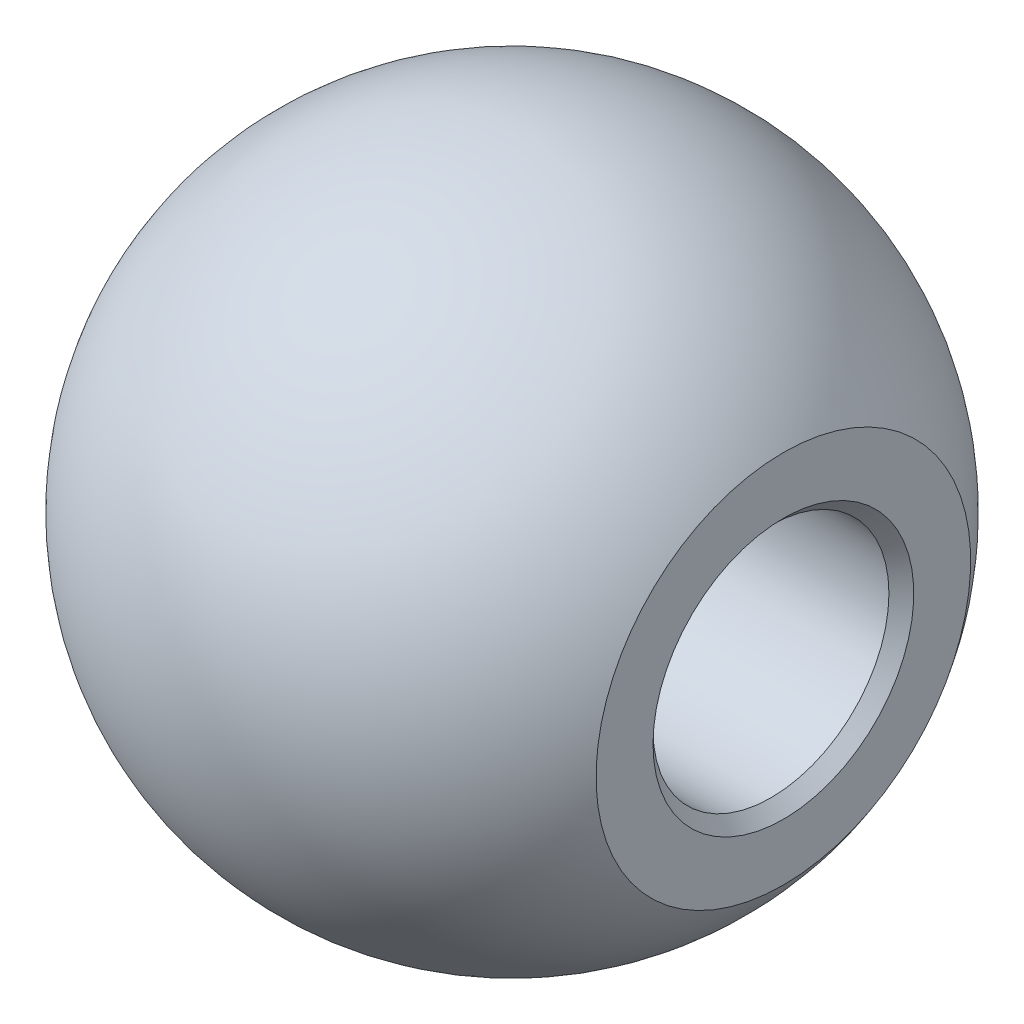
ISO-10303-21;
HEADER;
FILE_DESCRIPTION(('STEP AP214'),'2;1');
FILE_NAME('part.step','',(''),(''),'','','');
FILE_SCHEMA(('AUTOMOTIVE_DESIGN { 1 0 10303 214 1 1 1 1 }'));
ENDSEC;
DATA;
#1=APPLICATION_CONTEXT('core data for automotive mechanical design processes');
#2=APPLICATION_PROTOCOL_DEFINITION('international standard','automotive_design',2000,#1);
#3=PRODUCT_CONTEXT('',#1,'mechanical');
#4=PRODUCT('Part','Part','',(#3));
#5=PRODUCT_RELATED_PRODUCT_CATEGORY('part','',(#4));
#6=PRODUCT_DEFINITION_FORMATION('','',#4);
#7=PRODUCT_DEFINITION_CONTEXT('part definition',#1,'design');
#8=PRODUCT_DEFINITION('design','',#6,#7);
#9=PRODUCT_DEFINITION_SHAPE('','',#8);
#10=(LENGTH_UNIT() NAMED_UNIT(*) SI_UNIT(.MILLI.,.METRE.));
#11=(NAMED_UNIT(*) PLANE_ANGLE_UNIT() SI_UNIT($,.RADIAN.));
#12=(NAMED_UNIT(*) SI_UNIT($,.STERADIAN.) SOLID_ANGLE_UNIT());
#13=UNCERTAINTY_MEASURE_WITH_UNIT(LENGTH_MEASURE(1.E-05),#10,'distance_accuracy_value','');
#14=(GEOMETRIC_REPRESENTATION_CONTEXT(3) GLOBAL_UNCERTAINTY_ASSIGNED_CONTEXT((#13)) GLOBAL_UNIT_ASSIGNED_CONTEXT((#10,
#11,#12)) REPRESENTATION_CONTEXT('',''));
#15=CARTESIAN_POINT('',(0.,0.,0.));
#16=DIRECTION('',(0.,0.,1.));
#17=DIRECTION('',(1.,0.,0.));
#18=AXIS2_PLACEMENT_3D('',#15,#16,#17);
#19=CARTESIAN_POINT('',(0.,0.,0.));
#20=DIRECTION('',(-1.,0.,0.));
#21=DIRECTION('',(0.,1.,0.));
#22=AXIS2_PLACEMENT_3D('',#19,#20,#21);
#23=SPHERICAL_SURFACE('',#22,6.7437);
#24=CARTESIAN_POINT('',(-5.5499,0.,0.));
#25=DIRECTION('',(-1.,0.,0.));
#26=DIRECTION('',(0.,0.,1.));
#27=AXIS2_PLACEMENT_3D('',#24,#25,#26);
#28=CIRCLE('',#27,3.8309397907041);
#29=CARTESIAN_POINT('',(-5.5499,3.8309397907041,0.));
#30=VERTEX_POINT('',#29);
#31=EDGE_CURVE('E52',#30,#30,#28,.T.);
#32=CARTESIAN_POINT('',(5.5499,0.,0.));
#33=DIRECTION('',(-1.,0.,0.));
#34=DIRECTION('',(0.,0.,1.));
#35=AXIS2_PLACEMENT_3D('',#32,#33,#34);
#36=CIRCLE('',#35,3.8309397907041);
#37=CARTESIAN_POINT('',(5.5499,3.8309397907041,0.));
#38=VERTEX_POINT('',#37);
#39=EDGE_CURVE('E55',#38,#38,#36,.T.);
#40=CARTESIAN_POINT('',(-5.5499,3.8309397907041,0.));
#41=CARTESIAN_POINT('',(-5.4727563580062,3.94270758581667,0.));
#42=CARTESIAN_POINT('',(-5.39222826981805,4.05213850969361,0.));
#43=CARTESIAN_POINT('',(-5.22471561022084,4.26594188232622,0.));
#44=CARTESIAN_POINT('',(-5.13773103881179,4.37031433108189,0.));
#45=CARTESIAN_POINT('',(-4.95761782194057,4.57361602082191,0.));
#46=CARTESIAN_POINT('',(-4.86448917647841,4.67254526180626,0.));
#47=CARTESIAN_POINT('',(-4.67242895147228,4.86460061003431,0.));
#48=CARTESIAN_POINT('',(-4.57349737192832,4.95772671727801,0.));
#49=CARTESIAN_POINT('',(-4.37019190095427,5.13783572124541,0.));
#50=CARTESIAN_POINT('',(-4.26581800952419,5.22481861796911,0.));
#51=CARTESIAN_POINT('',(-4.05200884798757,5.39232389442358,0.));
#52=CARTESIAN_POINT('',(-3.94257357788104,5.47284627415435,0.));
#53=CARTESIAN_POINT('',(-3.71904093862403,5.62713668801631,0.));
#54=CARTESIAN_POINT('',(-3.60494356947355,5.7009047221475,0.));
#55=CARTESIAN_POINT('',(-3.37250305527703,5.84141728682265,0.));
#56=CARTESIAN_POINT('',(-3.25415991023099,5.90816181736661,0.));
#57=CARTESIAN_POINT('',(-3.01365965057782,6.03438383727262,0.));
#58=CARTESIAN_POINT('',(-2.89150253597068,6.09386132663467,0.));
#59=CARTESIAN_POINT('',(-2.64382006220428,6.20533224425174,0.));
#60=CARTESIAN_POINT('',(-2.51829470304502,6.25732567250675,0.));
#61=CARTESIAN_POINT('',(-2.26433375454288,6.35363875519149,0.));
#62=CARTESIAN_POINT('',(-2.13589816520001,6.3979584096212,0.));
#63=CARTESIAN_POINT('',(-1.87658538965847,6.47876223198589,0.));
#64=CARTESIAN_POINT('',(-1.7457082034598,6.51524639992086,0.));
#65=CARTESIAN_POINT('',(-1.48198977634088,6.58024612656285,0.));
#66=CARTESIAN_POINT('',(-1.34914853542062,6.60876168526986,0.));
#67=CARTESIAN_POINT('',(-1.08198670740964,6.65772014643928,0.));
#68=CARTESIAN_POINT('',(-0.947666120318912,6.67816304890168,0.));
#69=CARTESIAN_POINT('',(-0.678035706324531,6.71090160591451,0.));
#70=CARTESIAN_POINT('',(-0.54272587942088,6.72319726046496,0.));
#71=CARTESIAN_POINT('',(-0.271610701678153,6.7395964575077,0.));
#72=CARTESIAN_POINT('',(-0.135805350839076,6.7437,0.));
#73=CARTESIAN_POINT('',(0.135805350839076,6.7437,0.));
#74=CARTESIAN_POINT('',(0.271610701678152,6.7395964575077,0.));
#75=CARTESIAN_POINT('',(0.54272587942088,6.72319726046496,0.));
#76=CARTESIAN_POINT('',(0.678035706324531,6.71090160591451,0.));
#77=CARTESIAN_POINT('',(0.947666120318912,6.67816304890168,0.));
#78=CARTESIAN_POINT('',(1.08198670740964,6.65772014643928,0.));
#79=CARTESIAN_POINT('',(1.34914853542063,6.60876168526986,0.));
#80=CARTESIAN_POINT('',(1.48198977634088,6.58024612656285,0.));
#81=CARTESIAN_POINT('',(1.7457082034598,6.51524639992086,0.));
#82=CARTESIAN_POINT('',(1.87658538965847,6.47876223198589,0.));
#83=CARTESIAN_POINT('',(2.13589816520001,6.3979584096212,0.));
#84=CARTESIAN_POINT('',(2.26433375454288,6.35363875519149,0.));
#85=CARTESIAN_POINT('',(2.51829470304502,6.25732567250675,0.));
#86=CARTESIAN_POINT('',(2.64382006220428,6.20533224425174,0.));
#87=CARTESIAN_POINT('',(2.89150253597068,6.09386132663467,0.));
#88=CARTESIAN_POINT('',(3.01365965057782,6.03438383727262,0.));
#89=CARTESIAN_POINT('',(3.25415991023099,5.90816181736661,0.));
#90=CARTESIAN_POINT('',(3.37250305527703,5.84141728682265,0.));
#91=CARTESIAN_POINT('',(3.60494356947355,5.7009047221475,0.));
#92=CARTESIAN_POINT('',(3.71904093862403,5.62713668801631,0.));
#93=CARTESIAN_POINT('',(3.94257357788104,5.47284627415435,0.));
#94=CARTESIAN_POINT('',(4.05200884798757,5.39232389442358,0.));
#95=CARTESIAN_POINT('',(4.26581800952419,5.22481861796911,0.));
#96=CARTESIAN_POINT('',(4.37019190095427,5.13783572124541,0.));
#97=CARTESIAN_POINT('',(4.57349737192832,4.95772671727801,0.));
#98=CARTESIAN_POINT('',(4.67242895147228,4.86460061003431,0.));
#99=CARTESIAN_POINT('',(4.86448917647841,4.67254526180626,0.));
#100=CARTESIAN_POINT('',(4.95761782194057,4.57361602082191,0.));
#101=CARTESIAN_POINT('',(5.13773103881179,4.37031433108189,0.));
#102=CARTESIAN_POINT('',(5.22471561022084,4.26594188232622,0.));
#103=CARTESIAN_POINT('',(5.39222826981804,4.05213850969361,0.));
#104=CARTESIAN_POINT('',(5.4727563580062,3.94270758581667,0.));
#105=CARTESIAN_POINT('',(5.5499,3.8309397907041,0.));
#106=B_SPLINE_CURVE_WITH_KNOTS('',3,(#40,#41,#42,#43,#44,#45,#46,#47,#48,#49,#50,#51,#52,#53,
#54,#55,#56,#57,#58,#59,#60,#61,#62,#63,#64,#65,#66,#67,#68,#69,#70,#71,#72,#73,#74,#75,#76,#77,
#78,#79,#80,#81,#82,#83,#84,#85,#86,#87,#88,#89,#90,#91,#92,#93,#94,#95,#96,#97,#98,#99,#100,
#101,#102,#103,#104,#105),.UNSPECIFIED.,.F.,.F.,(4,2,2,2,2,2,2,2,2,2,2,2,2,2,2,2,2,2,2,2,2,2,2,
2,2,2,2,2,2,2,2,2,4),(0.,0.407354126170114,0.814708252340229,1.22206237851034,1.62941650468046,
2.03677063085057,2.44412475702069,2.8514788831908,3.25883300936092,3.66618713553103,
4.07354126170115,4.48089538787126,4.88824951404138,5.29560364021149,5.70295776638161,
6.11031189255172,6.51766601872184,6.92502014489195,7.33237427106207,7.73972839723218,
8.14708252340229,8.55443664957241,8.96179077574253,9.36914490191264,9.77649902808276,
10.1838531542529,10.591207280423,10.9985614065931,11.4059155327632,11.8132696589333,
12.2206237851034,12.6279779112736,13.0353320374437),.UNSPECIFIED.);
#107=EDGE_CURVE('BSEAM32',#30,#38,#106,.T.);
#108=ORIENTED_EDGE('',*,*,#31,.F.);
#109=ORIENTED_EDGE('',*,*,#39,.T.);
#110=ORIENTED_EDGE('',*,*,#107,.T.);
#111=ORIENTED_EDGE('',*,*,#107,.F.);
#112=EDGE_LOOP('',(#108,#110,#109,#111));
#113=FACE_BOUND('',#112,.T.);
#114=ADVANCED_FACE('F32',(#113),#23,.T.);
#115=CARTESIAN_POINT('',(-5.5499,3.8309397907041,0.));
#116=DIRECTION('',(1.,0.,0.));
#117=DIRECTION('',(0.,0.,-1.));
#118=AXIS2_PLACEMENT_3D('',#115,#116,#117);
#119=PLANE('',#118);
#120=CARTESIAN_POINT('',(-5.5499,0.,0.));
#121=DIRECTION('',(1.,0.,0.));
#122=DIRECTION('',(0.,0.,-1.));
#123=AXIS2_PLACEMENT_3D('',#120,#121,#122);
#124=CIRCLE('',#123,2.66700000000001);
#125=CARTESIAN_POINT('',(-5.5499,0.,-2.66700000000001));
#126=VERTEX_POINT('',#125);
#127=EDGE_CURVE('E39',#126,#126,#124,.T.);
#128=ORIENTED_EDGE('',*,*,#127,.T.);
#129=EDGE_LOOP('',(#128));
#130=FACE_BOUND('',#129,.T.);
#131=ORIENTED_EDGE('',*,*,#31,.T.);
#132=EDGE_LOOP('',(#131));
#133=FACE_BOUND('',#132,.T.);
#134=ADVANCED_FACE('F70',(#130,#133),#119,.F.);
#135=CARTESIAN_POINT('',(-6.88514664457328,0.,0.));
#136=DIRECTION('',(-1.,0.,0.));
#137=DIRECTION('',(0.,0.,1.));
#138=AXIS2_PLACEMENT_3D('',#135,#136,#137);
#139=CYLINDRICAL_SURFACE('',#138,2.413);
#140=CARTESIAN_POINT('',(-5.2959,0.,0.));
#141=DIRECTION('',(1.,0.,0.));
#142=DIRECTION('',(0.,0.,-1.));
#143=AXIS2_PLACEMENT_3D('',#140,#141,#142);
#144=CIRCLE('',#143,2.413);
#145=CARTESIAN_POINT('',(-5.2959,0.,-2.413));
#146=VERTEX_POINT('',#145);
#147=EDGE_CURVE('E43',#146,#146,#144,.F.);
#148=ORIENTED_EDGE('',*,*,#147,.T.);
#149=EDGE_LOOP('',(#148));
#150=FACE_BOUND('',#149,.T.);
#151=CARTESIAN_POINT('',(5.2959,0.,0.));
#152=DIRECTION('',(-1.,0.,0.));
#153=DIRECTION('',(0.,0.,1.));
#154=AXIS2_PLACEMENT_3D('',#151,#152,#153);
#155=CIRCLE('',#154,2.413);
#156=CARTESIAN_POINT('',(5.2959,0.,2.413));
#157=VERTEX_POINT('',#156);
#158=EDGE_CURVE('E47',#157,#157,#155,.F.);
#159=ORIENTED_EDGE('',*,*,#158,.T.);
#160=EDGE_LOOP('',(#159));
#161=FACE_BOUND('',#160,.T.);
#162=ADVANCED_FACE('F63',(#150,#161),#139,.F.);
#163=CARTESIAN_POINT('',(5.5499,2.413,0.));
#164=DIRECTION('',(-1.,0.,0.));
#165=DIRECTION('',(0.,0.,1.));
#166=AXIS2_PLACEMENT_3D('',#163,#164,#165);
#167=PLANE('',#166);
#168=CARTESIAN_POINT('',(5.5499,0.,0.));
#169=DIRECTION('',(-1.,0.,0.));
#170=DIRECTION('',(0.,0.,1.));
#171=AXIS2_PLACEMENT_3D('',#168,#169,#170);
#172=CIRCLE('',#171,2.66700000000001);
#173=CARTESIAN_POINT('',(5.5499,0.,2.66700000000001));
#174=VERTEX_POINT('',#173);
#175=EDGE_CURVE('E10',#174,#174,#172,.T.);
#176=ORIENTED_EDGE('',*,*,#175,.T.);
#177=EDGE_LOOP('',(#176));
#178=FACE_BOUND('',#177,.T.);
#179=ORIENTED_EDGE('',*,*,#39,.F.);
#180=EDGE_LOOP('',(#179));
#181=FACE_BOUND('',#180,.T.);
#182=ADVANCED_FACE('F60',(#178,#181),#167,.F.);
#183=CARTESIAN_POINT('',(-5.2959,0.,0.));
#184=DIRECTION('',(-1.,0.,0.));
#185=DIRECTION('',(0.,0.,1.));
#186=AXIS2_PLACEMENT_3D('',#183,#184,#185);
#187=CONICAL_SURFACE('',#186,2.413,0.785398163397449);
#188=ORIENTED_EDGE('',*,*,#127,.F.);
#189=EDGE_LOOP('',(#188));
#190=FACE_BOUND('',#189,.T.);
#191=ORIENTED_EDGE('',*,*,#147,.F.);
#192=EDGE_LOOP('',(#191));
#193=FACE_BOUND('',#192,.T.);
#194=ADVANCED_FACE('F62',(#190,#193),#187,.F.);
#195=CARTESIAN_POINT('',(5.5499,0.,0.));
#196=DIRECTION('',(1.,0.,0.));
#197=DIRECTION('',(0.,0.,-1.));
#198=AXIS2_PLACEMENT_3D('',#195,#196,#197);
#199=CONICAL_SURFACE('',#198,2.667,0.785398163397452);
#200=ORIENTED_EDGE('',*,*,#158,.F.);
#201=EDGE_LOOP('',(#200));
#202=FACE_BOUND('',#201,.T.);
#203=ORIENTED_EDGE('',*,*,#175,.F.);
#204=EDGE_LOOP('',(#203));
#205=FACE_BOUND('',#204,.T.);
#206=ADVANCED_FACE('F34',(#202,#205),#199,.F.);
#207=CLOSED_SHELL('',(#114,#134,#162,#182,#194,#206));
#208=MANIFOLD_SOLID_BREP('B2',#207);
#209=ADVANCED_BREP_SHAPE_REPRESENTATION('',(#18,#208),#14);
#210=SHAPE_DEFINITION_REPRESENTATION(#9,#209);
ENDSEC;
END-ISO-10303-21;
